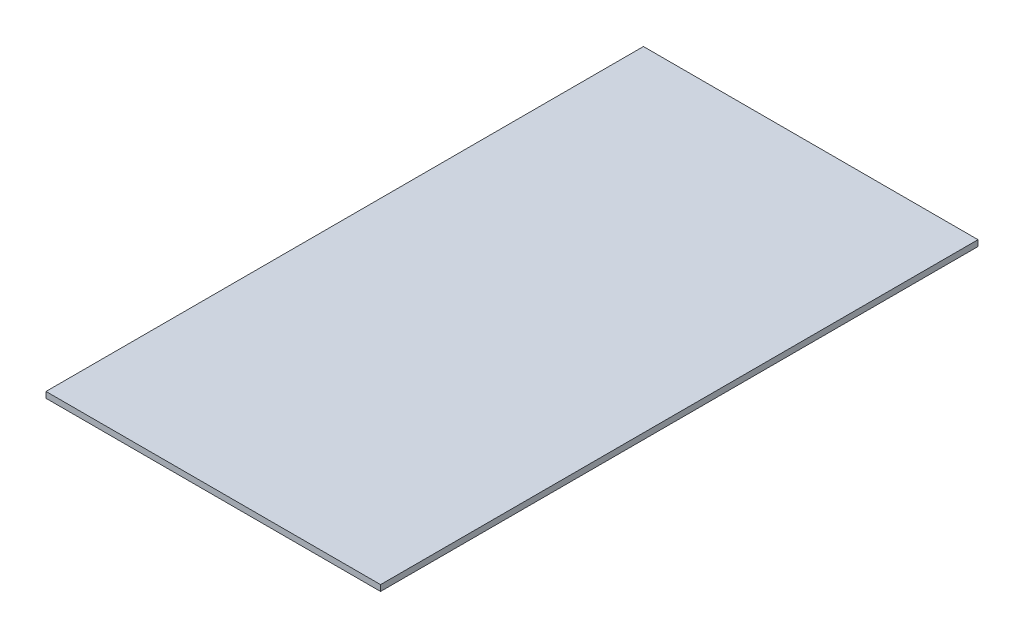
ISO-10303-21;
HEADER;
FILE_DESCRIPTION(('STEP AP214'),'2;1');
FILE_NAME('part.step','',(''),(''),'','','');
FILE_SCHEMA(('AUTOMOTIVE_DESIGN { 1 0 10303 214 1 1 1 1 }'));
ENDSEC;
DATA;
#1=APPLICATION_CONTEXT('core data for automotive mechanical design processes');
#2=APPLICATION_PROTOCOL_DEFINITION('international standard','automotive_design',2000,#1);
#3=PRODUCT_CONTEXT('',#1,'mechanical');
#4=PRODUCT('Part','Part','',(#3));
#5=PRODUCT_RELATED_PRODUCT_CATEGORY('part','',(#4));
#6=PRODUCT_DEFINITION_FORMATION('','',#4);
#7=PRODUCT_DEFINITION_CONTEXT('part definition',#1,'design');
#8=PRODUCT_DEFINITION('design','',#6,#7);
#9=PRODUCT_DEFINITION_SHAPE('','',#8);
#10=(LENGTH_UNIT() NAMED_UNIT(*) SI_UNIT(.MILLI.,.METRE.));
#11=(NAMED_UNIT(*) PLANE_ANGLE_UNIT() SI_UNIT($,.RADIAN.));
#12=(NAMED_UNIT(*) SI_UNIT($,.STERADIAN.) SOLID_ANGLE_UNIT());
#13=UNCERTAINTY_MEASURE_WITH_UNIT(LENGTH_MEASURE(1.E-05),#10,'distance_accuracy_value','');
#14=(GEOMETRIC_REPRESENTATION_CONTEXT(3) GLOBAL_UNCERTAINTY_ASSIGNED_CONTEXT((#13)) GLOBAL_UNIT_ASSIGNED_CONTEXT((#10,
#11,#12)) REPRESENTATION_CONTEXT('',''));
#15=CARTESIAN_POINT('',(0.,0.,0.));
#16=DIRECTION('',(0.,0.,1.));
#17=DIRECTION('',(1.,0.,0.));
#18=AXIS2_PLACEMENT_3D('',#15,#16,#17);
#19=CARTESIAN_POINT('',(-234.578448041994,5.,-54.2328366274553));
#20=DIRECTION('',(0.,0.,-1.));
#21=DIRECTION('',(-1.,0.,0.));
#22=AXIS2_PLACEMENT_3D('',#19,#20,#21);
#23=PLANE('',#22);
#24=DIRECTION('',(1.,0.,0.));
#25=VECTOR('',#24,1.);
#26=CARTESIAN_POINT('',(-234.578448041994,0.,-54.2328366274553));
#27=LINE('',#26,#25);
#28=CARTESIAN_POINT('',(-234.578448041994,0.,-54.2328366274553));
#29=VERTEX_POINT('',#28);
#30=CARTESIAN_POINT('',(45.4215519580061,0.,-54.2328366274553));
#31=VERTEX_POINT('',#30);
#32=EDGE_CURVE('E110',#29,#31,#27,.T.);
#33=ORIENTED_EDGE('',*,*,#32,.F.);
#34=DIRECTION('',(0.,-1.,0.));
#35=VECTOR('',#34,1.);
#36=CARTESIAN_POINT('',(-234.578448041994,5.,-54.2328366274553));
#37=LINE('',#36,#35);
#38=CARTESIAN_POINT('',(-234.578448041994,5.,-54.2328366274553));
#39=VERTEX_POINT('',#38);
#40=EDGE_CURVE('E11',#39,#29,#37,.T.);
#41=ORIENTED_EDGE('',*,*,#40,.F.);
#42=DIRECTION('',(1.,0.,0.));
#43=VECTOR('',#42,1.);
#44=CARTESIAN_POINT('',(-234.578448041994,5.,-54.2328366274553));
#45=LINE('',#44,#43);
#46=CARTESIAN_POINT('',(45.4215519580061,5.,-54.2328366274553));
#47=VERTEX_POINT('',#46);
#48=EDGE_CURVE('E103',#39,#47,#45,.T.);
#49=ORIENTED_EDGE('',*,*,#48,.T.);
#50=DIRECTION('',(0.,-1.,0.));
#51=VECTOR('',#50,1.);
#52=CARTESIAN_POINT('',(45.4215519580061,5.,-54.2328366274553));
#53=LINE('',#52,#51);
#54=EDGE_CURVE('E42',#47,#31,#53,.T.);
#55=ORIENTED_EDGE('',*,*,#54,.T.);
#56=EDGE_LOOP('',(#33,#41,#49,#55));
#57=FACE_BOUND('',#56,.T.);
#58=ADVANCED_FACE('F39',(#57),#23,.T.);
#59=CARTESIAN_POINT('',(-234.578448041994,5.,-54.2328366274553));
#60=DIRECTION('',(1.,0.,0.));
#61=DIRECTION('',(0.,0.,-1.));
#62=AXIS2_PLACEMENT_3D('',#59,#60,#61);
#63=PLANE('',#62);
#64=DIRECTION('',(0.,0.,1.));
#65=VECTOR('',#64,1.);
#66=CARTESIAN_POINT('',(-234.578448041994,0.,-54.2328366274553));
#67=LINE('',#66,#65);
#68=CARTESIAN_POINT('',(-234.578448041994,0.,445.767163372545));
#69=VERTEX_POINT('',#68);
#70=EDGE_CURVE('E73',#29,#69,#67,.T.);
#71=ORIENTED_EDGE('',*,*,#70,.T.);
#72=DIRECTION('',(0.,-1.,0.));
#73=VECTOR('',#72,1.);
#74=CARTESIAN_POINT('',(-234.578448041994,5.,445.767163372545));
#75=LINE('',#74,#73);
#76=CARTESIAN_POINT('',(-234.578448041994,5.,445.767163372545));
#77=VERTEX_POINT('',#76);
#78=EDGE_CURVE('E49',#77,#69,#75,.T.);
#79=ORIENTED_EDGE('',*,*,#78,.F.);
#80=DIRECTION('',(0.,0.,1.));
#81=VECTOR('',#80,1.);
#82=CARTESIAN_POINT('',(-234.578448041994,5.,-54.2328366274553));
#83=LINE('',#82,#81);
#84=EDGE_CURVE('E90',#39,#77,#83,.T.);
#85=ORIENTED_EDGE('',*,*,#84,.F.);
#86=ORIENTED_EDGE('',*,*,#40,.T.);
#87=EDGE_LOOP('',(#71,#79,#85,#86));
#88=FACE_BOUND('',#87,.T.);
#89=ADVANCED_FACE('F126',(#88),#63,.F.);
#90=CARTESIAN_POINT('',(-234.578448041994,5.,445.767163372545));
#91=DIRECTION('',(0.,0.,-1.));
#92=DIRECTION('',(-1.,0.,0.));
#93=AXIS2_PLACEMENT_3D('',#90,#91,#92);
#94=PLANE('',#93);
#95=DIRECTION('',(1.,0.,0.));
#96=VECTOR('',#95,1.);
#97=CARTESIAN_POINT('',(-234.578448041994,0.,445.767163372545));
#98=LINE('',#97,#96);
#99=CARTESIAN_POINT('',(45.4215519580061,0.,445.767163372545));
#100=VERTEX_POINT('',#99);
#101=EDGE_CURVE('E98',#69,#100,#98,.T.);
#102=ORIENTED_EDGE('',*,*,#101,.T.);
#103=DIRECTION('',(0.,-1.,0.));
#104=VECTOR('',#103,1.);
#105=CARTESIAN_POINT('',(45.4215519580061,5.,445.767163372545));
#106=LINE('',#105,#104);
#107=CARTESIAN_POINT('',(45.4215519580061,5.,445.767163372545));
#108=VERTEX_POINT('',#107);
#109=EDGE_CURVE('E95',#108,#100,#106,.T.);
#110=ORIENTED_EDGE('',*,*,#109,.F.);
#111=DIRECTION('',(1.,0.,0.));
#112=VECTOR('',#111,1.);
#113=CARTESIAN_POINT('',(-234.578448041994,5.,445.767163372545));
#114=LINE('',#113,#112);
#115=EDGE_CURVE('E85',#77,#108,#114,.T.);
#116=ORIENTED_EDGE('',*,*,#115,.F.);
#117=ORIENTED_EDGE('',*,*,#78,.T.);
#118=EDGE_LOOP('',(#102,#110,#116,#117));
#119=FACE_BOUND('',#118,.T.);
#120=ADVANCED_FACE('F96',(#119),#94,.F.);
#121=CARTESIAN_POINT('',(45.4215519580061,5.,-54.2328366274553));
#122=DIRECTION('',(1.,0.,0.));
#123=DIRECTION('',(0.,0.,-1.));
#124=AXIS2_PLACEMENT_3D('',#121,#122,#123);
#125=PLANE('',#124);
#126=DIRECTION('',(0.,0.,1.));
#127=VECTOR('',#126,1.);
#128=CARTESIAN_POINT('',(45.4215519580061,0.,-54.2328366274553));
#129=LINE('',#128,#127);
#130=EDGE_CURVE('E114',#31,#100,#129,.T.);
#131=ORIENTED_EDGE('',*,*,#130,.F.);
#132=ORIENTED_EDGE('',*,*,#54,.F.);
#133=DIRECTION('',(0.,0.,1.));
#134=VECTOR('',#133,1.);
#135=CARTESIAN_POINT('',(45.4215519580061,5.,-54.2328366274553));
#136=LINE('',#135,#134);
#137=EDGE_CURVE('E89',#47,#108,#136,.T.);
#138=ORIENTED_EDGE('',*,*,#137,.T.);
#139=ORIENTED_EDGE('',*,*,#109,.T.);
#140=EDGE_LOOP('',(#131,#132,#138,#139));
#141=FACE_BOUND('',#140,.T.);
#142=ADVANCED_FACE('F101',(#141),#125,.T.);
#143=CARTESIAN_POINT('',(0.,5.,0.));
#144=DIRECTION('',(0.,-1.,0.));
#145=DIRECTION('',(0.,0.,-1.));
#146=AXIS2_PLACEMENT_3D('',#143,#144,#145);
#147=PLANE('',#146);
#148=ORIENTED_EDGE('',*,*,#48,.F.);
#149=ORIENTED_EDGE('',*,*,#84,.T.);
#150=ORIENTED_EDGE('',*,*,#115,.T.);
#151=ORIENTED_EDGE('',*,*,#137,.F.);
#152=EDGE_LOOP('',(#148,#149,#150,#151));
#153=FACE_BOUND('',#152,.T.);
#154=ADVANCED_FACE('F88',(#153),#147,.F.);
#155=CARTESIAN_POINT('',(0.,0.,0.));
#156=DIRECTION('',(0.,-1.,0.));
#157=DIRECTION('',(0.,0.,-1.));
#158=AXIS2_PLACEMENT_3D('',#155,#156,#157);
#159=PLANE('',#158);
#160=ORIENTED_EDGE('',*,*,#32,.T.);
#161=ORIENTED_EDGE('',*,*,#130,.T.);
#162=ORIENTED_EDGE('',*,*,#101,.F.);
#163=ORIENTED_EDGE('',*,*,#70,.F.);
#164=EDGE_LOOP('',(#160,#161,#162,#163));
#165=FACE_BOUND('',#164,.T.);
#166=ADVANCED_FACE('F123',(#165),#159,.T.);
#167=CLOSED_SHELL('',(#58,#89,#120,#142,#154,#166));
#168=MANIFOLD_SOLID_BREP('B2',#167);
#169=ADVANCED_BREP_SHAPE_REPRESENTATION('',(#18,#168),#14);
#170=SHAPE_DEFINITION_REPRESENTATION(#9,#169);
ENDSEC;
END-ISO-10303-21;
